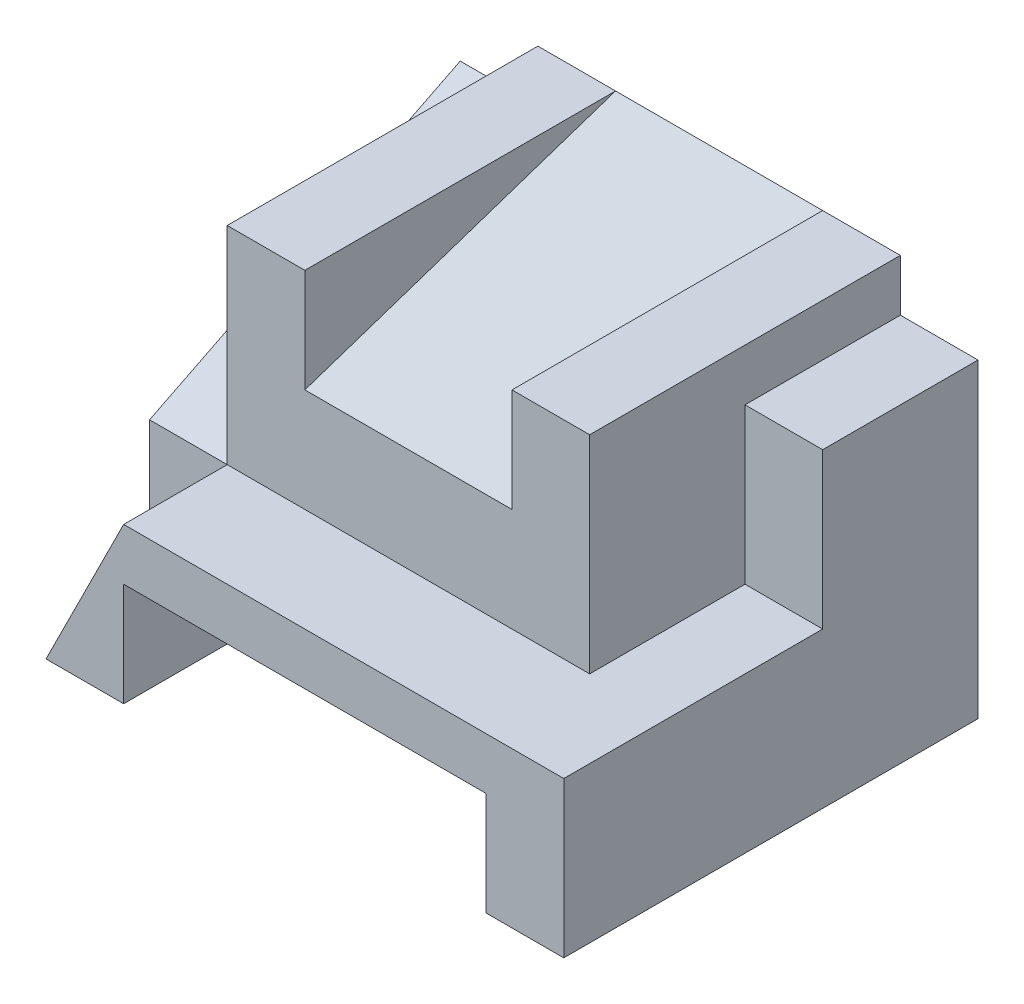
ISO-10303-21;
HEADER;
FILE_DESCRIPTION(('STEP AP214'),'2;1');
FILE_NAME('part.step','',(''),(''),'','','');
FILE_SCHEMA(('AUTOMOTIVE_DESIGN { 1 0 10303 214 1 1 1 1 }'));
ENDSEC;
DATA;
#1=APPLICATION_CONTEXT('core data for automotive mechanical design processes');
#2=APPLICATION_PROTOCOL_DEFINITION('international standard','automotive_design',2000,#1);
#3=PRODUCT_CONTEXT('',#1,'mechanical');
#4=PRODUCT('Part','Part','',(#3));
#5=PRODUCT_RELATED_PRODUCT_CATEGORY('part','',(#4));
#6=PRODUCT_DEFINITION_FORMATION('','',#4);
#7=PRODUCT_DEFINITION_CONTEXT('part definition',#1,'design');
#8=PRODUCT_DEFINITION('design','',#6,#7);
#9=PRODUCT_DEFINITION_SHAPE('','',#8);
#10=(LENGTH_UNIT() NAMED_UNIT(*) SI_UNIT(.MILLI.,.METRE.));
#11=(NAMED_UNIT(*) PLANE_ANGLE_UNIT() SI_UNIT($,.RADIAN.));
#12=(NAMED_UNIT(*) SI_UNIT($,.STERADIAN.) SOLID_ANGLE_UNIT());
#13=UNCERTAINTY_MEASURE_WITH_UNIT(LENGTH_MEASURE(1.E-05),#10,'distance_accuracy_value','');
#14=(GEOMETRIC_REPRESENTATION_CONTEXT(3) GLOBAL_UNCERTAINTY_ASSIGNED_CONTEXT((#13)) GLOBAL_UNIT_ASSIGNED_CONTEXT((#10,
#11,#12)) REPRESENTATION_CONTEXT('',''));
#15=CARTESIAN_POINT('',(0.,0.,0.));
#16=DIRECTION('',(0.,0.,1.));
#17=DIRECTION('',(1.,0.,0.));
#18=AXIS2_PLACEMENT_3D('',#15,#16,#17);
#19=CARTESIAN_POINT('',(-5.,3.,-8.));
#20=DIRECTION('',(0.,1.,0.));
#21=DIRECTION('',(0.,0.,1.));
#22=AXIS2_PLACEMENT_3D('',#19,#20,#21);
#23=PLANE('',#22);
#24=DIRECTION('',(0.,0.,1.));
#25=VECTOR('',#24,1.);
#26=CARTESIAN_POINT('',(5.,3.,-8.));
#27=LINE('',#26,#25);
#28=CARTESIAN_POINT('',(5.,3.,-5.));
#29=VERTEX_POINT('',#28);
#30=CARTESIAN_POINT('',(5.,3.,0.));
#31=VERTEX_POINT('',#30);
#32=EDGE_CURVE('E303',#29,#31,#27,.T.);
#33=ORIENTED_EDGE('',*,*,#32,.F.);
#34=DIRECTION('',(1.,0.,0.));
#35=VECTOR('',#34,1.);
#36=CARTESIAN_POINT('',(5.,3.,-5.));
#37=LINE('',#36,#35);
#38=CARTESIAN_POINT('',(3.5,3.,-5.));
#39=VERTEX_POINT('',#38);
#40=EDGE_CURVE('E178',#39,#29,#37,.T.);
#41=ORIENTED_EDGE('',*,*,#40,.F.);
#42=DIRECTION('',(0.,0.,1.));
#43=VECTOR('',#42,1.);
#44=CARTESIAN_POINT('',(3.5,3.,-8.));
#45=LINE('',#44,#43);
#46=CARTESIAN_POINT('',(3.5,3.,-2.));
#47=VERTEX_POINT('',#46);
#48=EDGE_CURVE('E183',#39,#47,#45,.T.);
#49=ORIENTED_EDGE('',*,*,#48,.T.);
#50=DIRECTION('',(1.,0.,0.));
#51=VECTOR('',#50,1.);
#52=CARTESIAN_POINT('',(3.5,3.,-2.));
#53=LINE('',#52,#51);
#54=CARTESIAN_POINT('',(-3.5,3.,-2.));
#55=VERTEX_POINT('',#54);
#56=EDGE_CURVE('E213',#55,#47,#53,.T.);
#57=ORIENTED_EDGE('',*,*,#56,.F.);
#58=DIRECTION('',(0.,0.,1.));
#59=VECTOR('',#58,1.);
#60=CARTESIAN_POINT('',(-3.5,3.,-2.));
#61=LINE('',#60,#59);
#62=CARTESIAN_POINT('',(-3.5,3.,0.));
#63=VERTEX_POINT('',#62);
#64=EDGE_CURVE('E254',#55,#63,#61,.T.);
#65=ORIENTED_EDGE('',*,*,#64,.T.);
#66=DIRECTION('',(-1.,0.,0.));
#67=VECTOR('',#66,1.);
#68=CARTESIAN_POINT('',(-5.,3.,0.));
#69=LINE('',#68,#67);
#70=EDGE_CURVE('E291',#31,#63,#69,.T.);
#71=ORIENTED_EDGE('',*,*,#70,.F.);
#72=EDGE_LOOP('',(#33,#41,#49,#57,#65,#71));
#73=FACE_BOUND('',#72,.T.);
#74=ADVANCED_FACE('F37',(#73),#23,.T.);
#75=CARTESIAN_POINT('',(3.5,7.,-8.));
#76=DIRECTION('',(1.,0.,0.));
#77=DIRECTION('',(0.,1.,0.));
#78=AXIS2_PLACEMENT_3D('',#75,#76,#77);
#79=PLANE('',#78);
#80=ORIENTED_EDGE('',*,*,#48,.F.);
#81=DIRECTION('',(0.,-1.,0.));
#82=VECTOR('',#81,1.);
#83=CARTESIAN_POINT('',(3.5,6.,-5.));
#84=LINE('',#83,#82);
#85=CARTESIAN_POINT('',(3.5,6.,-5.));
#86=VERTEX_POINT('',#85);
#87=EDGE_CURVE('E167',#86,#39,#84,.T.);
#88=ORIENTED_EDGE('',*,*,#87,.F.);
#89=DIRECTION('',(0.,0.,1.));
#90=VECTOR('',#89,1.);
#91=CARTESIAN_POINT('',(3.5,6.,-5.));
#92=LINE('',#91,#90);
#93=CARTESIAN_POINT('',(3.5,6.,-8.));
#94=VERTEX_POINT('',#93);
#95=EDGE_CURVE('E173',#94,#86,#92,.T.);
#96=ORIENTED_EDGE('',*,*,#95,.F.);
#97=DIRECTION('',(0.,1.,0.));
#98=VECTOR('',#97,1.);
#99=CARTESIAN_POINT('',(3.5,7.,-8.));
#100=LINE('',#99,#98);
#101=CARTESIAN_POINT('',(3.5,7.,-8.));
#102=VERTEX_POINT('',#101);
#103=EDGE_CURVE('E215',#94,#102,#100,.T.);
#104=ORIENTED_EDGE('',*,*,#103,.T.);
#105=DIRECTION('',(0.,0.,1.));
#106=VECTOR('',#105,1.);
#107=CARTESIAN_POINT('',(3.5,7.,-8.));
#108=LINE('',#107,#106);
#109=CARTESIAN_POINT('',(3.5,7.,-2.));
#110=VERTEX_POINT('',#109);
#111=EDGE_CURVE('E240',#102,#110,#108,.T.);
#112=ORIENTED_EDGE('',*,*,#111,.T.);
#113=DIRECTION('',(0.,1.,0.));
#114=VECTOR('',#113,1.);
#115=CARTESIAN_POINT('',(3.5,7.,-2.));
#116=LINE('',#115,#114);
#117=EDGE_CURVE('E227',#47,#110,#116,.T.);
#118=ORIENTED_EDGE('',*,*,#117,.F.);
#119=EDGE_LOOP('',(#80,#88,#96,#104,#112,#118));
#120=FACE_BOUND('',#119,.T.);
#121=ADVANCED_FACE('F181',(#120),#79,.T.);
#122=CARTESIAN_POINT('',(-3.5,3.,-8.));
#123=DIRECTION('',(-1.,0.,0.));
#124=DIRECTION('',(0.,-1.,0.));
#125=AXIS2_PLACEMENT_3D('',#122,#123,#124);
#126=PLANE('',#125);
#127=DIRECTION('',(0.,-1.,0.));
#128=VECTOR('',#127,1.);
#129=CARTESIAN_POINT('',(-3.5,3.,-8.));
#130=LINE('',#129,#128);
#131=CARTESIAN_POINT('',(-3.5,7.,-8.));
#132=VERTEX_POINT('',#131);
#133=CARTESIAN_POINT('',(-3.5,6.,-8.));
#134=VERTEX_POINT('',#133);
#135=EDGE_CURVE('E222',#132,#134,#130,.T.);
#136=ORIENTED_EDGE('',*,*,#135,.T.);
#137=DIRECTION('',(0.,0.447213595499958,-0.894427190999916));
#138=VECTOR('',#137,1.);
#139=CARTESIAN_POINT('',(-3.5,6.,-8.));
#140=LINE('',#139,#138);
#141=EDGE_CURVE('E184',#55,#134,#140,.T.);
#142=ORIENTED_EDGE('',*,*,#141,.F.);
#143=DIRECTION('',(0.,-1.,0.));
#144=VECTOR('',#143,1.);
#145=CARTESIAN_POINT('',(-3.5,3.,-2.));
#146=LINE('',#145,#144);
#147=CARTESIAN_POINT('',(-3.5,7.,-2.));
#148=VERTEX_POINT('',#147);
#149=EDGE_CURVE('E218',#148,#55,#146,.T.);
#150=ORIENTED_EDGE('',*,*,#149,.F.);
#151=DIRECTION('',(0.,0.,1.));
#152=VECTOR('',#151,1.);
#153=CARTESIAN_POINT('',(-3.5,7.,-8.));
#154=LINE('',#153,#152);
#155=EDGE_CURVE('E236',#132,#148,#154,.T.);
#156=ORIENTED_EDGE('',*,*,#155,.F.);
#157=EDGE_LOOP('',(#136,#142,#150,#156));
#158=FACE_BOUND('',#157,.T.);
#159=ADVANCED_FACE('F355',(#158),#126,.T.);
#160=CARTESIAN_POINT('',(-2.,5.,-2.));
#161=DIRECTION('',(-1.,0.,0.));
#162=DIRECTION('',(0.,0.,1.));
#163=AXIS2_PLACEMENT_3D('',#160,#161,#162);
#164=PLANE('',#163);
#165=DIRECTION('',(0.,0.316227766016838,-0.948683298050514));
#166=VECTOR('',#165,1.);
#167=CARTESIAN_POINT('',(-2.,7.,-8.));
#168=LINE('',#167,#166);
#169=CARTESIAN_POINT('',(-2.,5.,-2.));
#170=VERTEX_POINT('',#169);
#171=CARTESIAN_POINT('',(-2.,7.,-8.));
#172=VERTEX_POINT('',#171);
#173=EDGE_CURVE('E197',#170,#172,#168,.T.);
#174=ORIENTED_EDGE('',*,*,#173,.T.);
#175=DIRECTION('',(0.,0.,1.));
#176=VECTOR('',#175,1.);
#177=CARTESIAN_POINT('',(-2.,7.,-2.));
#178=LINE('',#177,#176);
#179=CARTESIAN_POINT('',(-2.,7.,-2.));
#180=VERTEX_POINT('',#179);
#181=EDGE_CURVE('E204',#172,#180,#178,.T.);
#182=ORIENTED_EDGE('',*,*,#181,.T.);
#183=DIRECTION('',(0.,1.,0.));
#184=VECTOR('',#183,1.);
#185=CARTESIAN_POINT('',(-2.,5.,-2.));
#186=LINE('',#185,#184);
#187=EDGE_CURVE('E62',#170,#180,#186,.T.);
#188=ORIENTED_EDGE('',*,*,#187,.F.);
#189=EDGE_LOOP('',(#174,#182,#188));
#190=FACE_BOUND('',#189,.T.);
#191=ADVANCED_FACE('F457',(#190),#164,.F.);
#192=CARTESIAN_POINT('',(2.,5.,-8.));
#193=DIRECTION('',(1.,0.,0.));
#194=DIRECTION('',(0.,0.,-1.));
#195=AXIS2_PLACEMENT_3D('',#192,#193,#194);
#196=PLANE('',#195);
#197=DIRECTION('',(0.,0.316227766016838,-0.948683298050514));
#198=VECTOR('',#197,1.);
#199=CARTESIAN_POINT('',(2.,7.,-8.));
#200=LINE('',#199,#198);
#201=CARTESIAN_POINT('',(2.,5.,-2.));
#202=VERTEX_POINT('',#201);
#203=CARTESIAN_POINT('',(2.,7.,-8.));
#204=VERTEX_POINT('',#203);
#205=EDGE_CURVE('E196',#202,#204,#200,.T.);
#206=ORIENTED_EDGE('',*,*,#205,.F.);
#207=DIRECTION('',(0.,1.,0.));
#208=VECTOR('',#207,1.);
#209=CARTESIAN_POINT('',(2.,5.,-2.));
#210=LINE('',#209,#208);
#211=CARTESIAN_POINT('',(2.,7.,-2.));
#212=VERTEX_POINT('',#211);
#213=EDGE_CURVE('E211',#202,#212,#210,.T.);
#214=ORIENTED_EDGE('',*,*,#213,.T.);
#215=DIRECTION('',(0.,0.,-1.));
#216=VECTOR('',#215,1.);
#217=CARTESIAN_POINT('',(2.,7.,-8.));
#218=LINE('',#217,#216);
#219=EDGE_CURVE('E208',#212,#204,#218,.T.);
#220=ORIENTED_EDGE('',*,*,#219,.T.);
#221=EDGE_LOOP('',(#206,#214,#220));
#222=FACE_BOUND('',#221,.T.);
#223=ADVANCED_FACE('F368',(#222),#196,.F.);
#224=CARTESIAN_POINT('',(-3.5,7.,-8.));
#225=DIRECTION('',(0.,1.,0.));
#226=DIRECTION('',(0.,0.,1.));
#227=AXIS2_PLACEMENT_3D('',#224,#225,#226);
#228=PLANE('',#227);
#229=ORIENTED_EDGE('',*,*,#181,.F.);
#230=DIRECTION('',(-1.,0.,0.));
#231=VECTOR('',#230,1.);
#232=CARTESIAN_POINT('',(-3.5,7.,-8.));
#233=LINE('',#232,#231);
#234=EDGE_CURVE('E217',#172,#132,#233,.T.);
#235=ORIENTED_EDGE('',*,*,#234,.T.);
#236=ORIENTED_EDGE('',*,*,#155,.T.);
#237=DIRECTION('',(-1.,0.,0.));
#238=VECTOR('',#237,1.);
#239=CARTESIAN_POINT('',(-3.5,7.,-2.));
#240=LINE('',#239,#238);
#241=EDGE_CURVE('E230',#180,#148,#240,.T.);
#242=ORIENTED_EDGE('',*,*,#241,.F.);
#243=EDGE_LOOP('',(#229,#235,#236,#242));
#244=FACE_BOUND('',#243,.T.);
#245=ADVANCED_FACE('F360',(#244),#228,.T.);
#246=CARTESIAN_POINT('',(-3.5,2.,-8.));
#247=DIRECTION('',(0.,-1.,0.));
#248=DIRECTION('',(0.,0.,-1.));
#249=AXIS2_PLACEMENT_3D('',#246,#247,#248);
#250=PLANE('',#249);
#251=DIRECTION('',(1.,0.,0.));
#252=VECTOR('',#251,1.);
#253=CARTESIAN_POINT('',(-3.5,2.,0.));
#254=LINE('',#253,#252);
#255=CARTESIAN_POINT('',(-3.5,2.,0.));
#256=VERTEX_POINT('',#255);
#257=CARTESIAN_POINT('',(3.5,2.,0.));
#258=VERTEX_POINT('',#257);
#259=EDGE_CURVE('E257',#256,#258,#254,.T.);
#260=ORIENTED_EDGE('',*,*,#259,.F.);
#261=DIRECTION('',(0.,0.,1.));
#262=VECTOR('',#261,1.);
#263=CARTESIAN_POINT('',(-3.5,2.,-8.));
#264=LINE('',#263,#262);
#265=CARTESIAN_POINT('',(-3.5,2.,-8.));
#266=VERTEX_POINT('',#265);
#267=EDGE_CURVE('E11',#266,#256,#264,.T.);
#268=ORIENTED_EDGE('',*,*,#267,.F.);
#269=DIRECTION('',(1.,0.,0.));
#270=VECTOR('',#269,1.);
#271=CARTESIAN_POINT('',(-3.5,2.,-8.));
#272=LINE('',#271,#270);
#273=CARTESIAN_POINT('',(3.5,2.,-8.));
#274=VERTEX_POINT('',#273);
#275=EDGE_CURVE('E259',#266,#274,#272,.T.);
#276=ORIENTED_EDGE('',*,*,#275,.T.);
#277=DIRECTION('',(0.,0.,1.));
#278=VECTOR('',#277,1.);
#279=CARTESIAN_POINT('',(3.5,2.,-8.));
#280=LINE('',#279,#278);
#281=EDGE_CURVE('E41',#274,#258,#280,.T.);
#282=ORIENTED_EDGE('',*,*,#281,.T.);
#283=EDGE_LOOP('',(#260,#268,#276,#282));
#284=FACE_BOUND('',#283,.T.);
#285=ADVANCED_FACE('F39',(#284),#250,.T.);
#286=CARTESIAN_POINT('',(-3.5,0.,-8.));
#287=DIRECTION('',(1.,0.,0.));
#288=DIRECTION('',(0.,1.,0.));
#289=AXIS2_PLACEMENT_3D('',#286,#287,#288);
#290=PLANE('',#289);
#291=DIRECTION('',(0.,1.,0.));
#292=VECTOR('',#291,1.);
#293=CARTESIAN_POINT('',(-3.5,0.,0.));
#294=LINE('',#293,#292);
#295=CARTESIAN_POINT('',(-3.5,0.,0.));
#296=VERTEX_POINT('',#295);
#297=EDGE_CURVE('E263',#296,#256,#294,.T.);
#298=ORIENTED_EDGE('',*,*,#297,.F.);
#299=DIRECTION('',(0.,0.,1.));
#300=VECTOR('',#299,1.);
#301=CARTESIAN_POINT('',(-3.5,0.,-8.));
#302=LINE('',#301,#300);
#303=CARTESIAN_POINT('',(-3.5,0.,-8.));
#304=VERTEX_POINT('',#303);
#305=EDGE_CURVE('E46',#304,#296,#302,.T.);
#306=ORIENTED_EDGE('',*,*,#305,.F.);
#307=DIRECTION('',(0.,1.,0.));
#308=VECTOR('',#307,1.);
#309=CARTESIAN_POINT('',(-3.5,0.,-8.));
#310=LINE('',#309,#308);
#311=EDGE_CURVE('E277',#304,#266,#310,.T.);
#312=ORIENTED_EDGE('',*,*,#311,.T.);
#313=ORIENTED_EDGE('',*,*,#267,.T.);
#314=EDGE_LOOP('',(#298,#306,#312,#313));
#315=FACE_BOUND('',#314,.T.);
#316=ADVANCED_FACE('F321',(#315),#290,.T.);
#317=CARTESIAN_POINT('',(-3.5,0.,-8.));
#318=DIRECTION('',(0.,-1.,0.));
#319=DIRECTION('',(1.,0.,0.));
#320=AXIS2_PLACEMENT_3D('',#317,#318,#319);
#321=PLANE('',#320);
#322=DIRECTION('',(1.,0.,0.));
#323=VECTOR('',#322,1.);
#324=CARTESIAN_POINT('',(-3.5,0.,0.));
#325=LINE('',#324,#323);
#326=CARTESIAN_POINT('',(-5.,0.,0.));
#327=VERTEX_POINT('',#326);
#328=EDGE_CURVE('E294',#327,#296,#325,.T.);
#329=ORIENTED_EDGE('',*,*,#328,.F.);
#330=DIRECTION('',(0.,0.,1.));
#331=VECTOR('',#330,1.);
#332=CARTESIAN_POINT('',(-5.,0.,-2.));
#333=LINE('',#332,#331);
#334=CARTESIAN_POINT('',(-5.,0.,-2.));
#335=VERTEX_POINT('',#334);
#336=EDGE_CURVE('E252',#335,#327,#333,.T.);
#337=ORIENTED_EDGE('',*,*,#336,.F.);
#338=DIRECTION('',(0.,0.,1.));
#339=VECTOR('',#338,1.);
#340=CARTESIAN_POINT('',(-5.,0.,-8.));
#341=LINE('',#340,#339);
#342=CARTESIAN_POINT('',(-5.,0.,-8.));
#343=VERTEX_POINT('',#342);
#344=EDGE_CURVE('E300',#343,#335,#341,.T.);
#345=ORIENTED_EDGE('',*,*,#344,.F.);
#346=DIRECTION('',(1.,0.,0.));
#347=VECTOR('',#346,1.);
#348=CARTESIAN_POINT('',(-3.5,0.,-8.));
#349=LINE('',#348,#347);
#350=EDGE_CURVE('E274',#343,#304,#349,.T.);
#351=ORIENTED_EDGE('',*,*,#350,.T.);
#352=ORIENTED_EDGE('',*,*,#305,.T.);
#353=EDGE_LOOP('',(#329,#337,#345,#351,#352));
#354=FACE_BOUND('',#353,.T.);
#355=ADVANCED_FACE('F346',(#354),#321,.T.);
#356=CARTESIAN_POINT('',(-5.,0.,-8.));
#357=DIRECTION('',(-1.,0.,0.));
#358=DIRECTION('',(0.,-1.,0.));
#359=AXIS2_PLACEMENT_3D('',#356,#357,#358);
#360=PLANE('',#359);
#361=DIRECTION('',(0.,-1.,0.));
#362=VECTOR('',#361,1.);
#363=CARTESIAN_POINT('',(-5.,3.,-2.));
#364=LINE('',#363,#362);
#365=CARTESIAN_POINT('',(-5.,3.,-2.));
#366=VERTEX_POINT('',#365);
#367=EDGE_CURVE('E243',#366,#335,#364,.T.);
#368=ORIENTED_EDGE('',*,*,#367,.F.);
#369=DIRECTION('',(0.,0.447213595499958,-0.894427190999916));
#370=VECTOR('',#369,1.);
#371=CARTESIAN_POINT('',(-5.,6.,-8.));
#372=LINE('',#371,#370);
#373=CARTESIAN_POINT('',(-5.,6.,-8.));
#374=VERTEX_POINT('',#373);
#375=EDGE_CURVE('E186',#366,#374,#372,.T.);
#376=ORIENTED_EDGE('',*,*,#375,.T.);
#377=DIRECTION('',(0.,-1.,0.));
#378=VECTOR('',#377,1.);
#379=CARTESIAN_POINT('',(-5.,0.,-8.));
#380=LINE('',#379,#378);
#381=EDGE_CURVE('E271',#374,#343,#380,.T.);
#382=ORIENTED_EDGE('',*,*,#381,.T.);
#383=ORIENTED_EDGE('',*,*,#344,.T.);
#384=EDGE_LOOP('',(#368,#376,#382,#383));
#385=FACE_BOUND('',#384,.T.);
#386=ADVANCED_FACE('F347',(#385),#360,.T.);
#387=CARTESIAN_POINT('',(5.,3.,-8.));
#388=DIRECTION('',(1.,0.,0.));
#389=DIRECTION('',(0.,1.,0.));
#390=AXIS2_PLACEMENT_3D('',#387,#388,#389);
#391=PLANE('',#390);
#392=DIRECTION('',(0.,1.,0.));
#393=VECTOR('',#392,1.);
#394=CARTESIAN_POINT('',(5.,3.,0.));
#395=LINE('',#394,#393);
#396=CARTESIAN_POINT('',(5.,0.,0.));
#397=VERTEX_POINT('',#396);
#398=EDGE_CURVE('E288',#397,#31,#395,.T.);
#399=ORIENTED_EDGE('',*,*,#398,.F.);
#400=DIRECTION('',(0.,0.,1.));
#401=VECTOR('',#400,1.);
#402=CARTESIAN_POINT('',(5.,0.,-8.));
#403=LINE('',#402,#401);
#404=CARTESIAN_POINT('',(5.,0.,-8.));
#405=VERTEX_POINT('',#404);
#406=EDGE_CURVE('E305',#405,#397,#403,.T.);
#407=ORIENTED_EDGE('',*,*,#406,.F.);
#408=DIRECTION('',(0.,1.,0.));
#409=VECTOR('',#408,1.);
#410=CARTESIAN_POINT('',(5.,3.,-8.));
#411=LINE('',#410,#409);
#412=CARTESIAN_POINT('',(5.,6.,-8.));
#413=VERTEX_POINT('',#412);
#414=EDGE_CURVE('E269',#405,#413,#411,.T.);
#415=ORIENTED_EDGE('',*,*,#414,.T.);
#416=DIRECTION('',(0.,0.,-1.));
#417=VECTOR('',#416,1.);
#418=CARTESIAN_POINT('',(5.,6.,-8.));
#419=LINE('',#418,#417);
#420=CARTESIAN_POINT('',(5.,6.,-5.));
#421=VERTEX_POINT('',#420);
#422=EDGE_CURVE('E172',#421,#413,#419,.T.);
#423=ORIENTED_EDGE('',*,*,#422,.F.);
#424=DIRECTION('',(0.,-1.,0.));
#425=VECTOR('',#424,1.);
#426=CARTESIAN_POINT('',(5.,6.,-5.));
#427=LINE('',#426,#425);
#428=EDGE_CURVE('E170',#421,#29,#427,.T.);
#429=ORIENTED_EDGE('',*,*,#428,.T.);
#430=ORIENTED_EDGE('',*,*,#32,.T.);
#431=EDGE_LOOP('',(#399,#407,#415,#423,#429,#430));
#432=FACE_BOUND('',#431,.T.);
#433=ADVANCED_FACE('F333',(#432),#391,.T.);
#434=CARTESIAN_POINT('',(5.,0.,-8.));
#435=DIRECTION('',(0.,-1.,0.));
#436=DIRECTION('',(1.,0.,0.));
#437=AXIS2_PLACEMENT_3D('',#434,#435,#436);
#438=PLANE('',#437);
#439=DIRECTION('',(1.,0.,0.));
#440=VECTOR('',#439,1.);
#441=CARTESIAN_POINT('',(5.,0.,0.));
#442=LINE('',#441,#440);
#443=CARTESIAN_POINT('',(3.5,0.,0.));
#444=VERTEX_POINT('',#443);
#445=EDGE_CURVE('E285',#444,#397,#442,.T.);
#446=ORIENTED_EDGE('',*,*,#445,.F.);
#447=DIRECTION('',(0.,0.,1.));
#448=VECTOR('',#447,1.);
#449=CARTESIAN_POINT('',(3.5,0.,-8.));
#450=LINE('',#449,#448);
#451=CARTESIAN_POINT('',(3.5,0.,-8.));
#452=VERTEX_POINT('',#451);
#453=EDGE_CURVE('E306',#452,#444,#450,.T.);
#454=ORIENTED_EDGE('',*,*,#453,.F.);
#455=DIRECTION('',(1.,0.,0.));
#456=VECTOR('',#455,1.);
#457=CARTESIAN_POINT('',(5.,0.,-8.));
#458=LINE('',#457,#456);
#459=EDGE_CURVE('E266',#452,#405,#458,.T.);
#460=ORIENTED_EDGE('',*,*,#459,.T.);
#461=ORIENTED_EDGE('',*,*,#406,.T.);
#462=EDGE_LOOP('',(#446,#454,#460,#461));
#463=FACE_BOUND('',#462,.T.);
#464=ADVANCED_FACE('F329',(#463),#438,.T.);
#465=CARTESIAN_POINT('',(3.5,2.,-8.));
#466=DIRECTION('',(-1.,0.,0.));
#467=DIRECTION('',(0.,-1.,0.));
#468=AXIS2_PLACEMENT_3D('',#465,#466,#467);
#469=PLANE('',#468);
#470=DIRECTION('',(0.,-1.,0.));
#471=VECTOR('',#470,1.);
#472=CARTESIAN_POINT('',(3.5,2.,0.));
#473=LINE('',#472,#471);
#474=EDGE_CURVE('E282',#258,#444,#473,.T.);
#475=ORIENTED_EDGE('',*,*,#474,.F.);
#476=ORIENTED_EDGE('',*,*,#281,.F.);
#477=DIRECTION('',(0.,-1.,0.));
#478=VECTOR('',#477,1.);
#479=CARTESIAN_POINT('',(3.5,2.,-8.));
#480=LINE('',#479,#478);
#481=EDGE_CURVE('E262',#274,#452,#480,.T.);
#482=ORIENTED_EDGE('',*,*,#481,.T.);
#483=ORIENTED_EDGE('',*,*,#453,.T.);
#484=EDGE_LOOP('',(#475,#476,#482,#483));
#485=FACE_BOUND('',#484,.T.);
#486=ADVANCED_FACE('F314',(#485),#469,.T.);
#487=CARTESIAN_POINT('',(0.,0.,-8.));
#488=DIRECTION('',(0.,0.,-1.));
#489=DIRECTION('',(-1.,0.,0.));
#490=AXIS2_PLACEMENT_3D('',#487,#488,#489);
#491=PLANE('',#490);
#492=ORIENTED_EDGE('',*,*,#381,.F.);
#493=DIRECTION('',(1.,0.,0.));
#494=VECTOR('',#493,1.);
#495=CARTESIAN_POINT('',(-5.,6.,-8.));
#496=LINE('',#495,#494);
#497=EDGE_CURVE('E192',#374,#134,#496,.T.);
#498=ORIENTED_EDGE('',*,*,#497,.T.);
#499=ORIENTED_EDGE('',*,*,#135,.F.);
#500=ORIENTED_EDGE('',*,*,#234,.F.);
#501=DIRECTION('',(1.,0.,0.));
#502=VECTOR('',#501,1.);
#503=CARTESIAN_POINT('',(-2.,7.,-8.));
#504=LINE('',#503,#502);
#505=EDGE_CURVE('E199',#172,#204,#504,.T.);
#506=ORIENTED_EDGE('',*,*,#505,.T.);
#507=EDGE_CURVE('E219',#102,#204,#233,.T.);
#508=ORIENTED_EDGE('',*,*,#507,.F.);
#509=ORIENTED_EDGE('',*,*,#103,.F.);
#510=DIRECTION('',(-1.,0.,0.));
#511=VECTOR('',#510,1.);
#512=CARTESIAN_POINT('',(3.5,6.,-8.));
#513=LINE('',#512,#511);
#514=EDGE_CURVE('E54',#413,#94,#513,.T.);
#515=ORIENTED_EDGE('',*,*,#514,.F.);
#516=ORIENTED_EDGE('',*,*,#414,.F.);
#517=ORIENTED_EDGE('',*,*,#459,.F.);
#518=ORIENTED_EDGE('',*,*,#481,.F.);
#519=ORIENTED_EDGE('',*,*,#275,.F.);
#520=ORIENTED_EDGE('',*,*,#311,.F.);
#521=ORIENTED_EDGE('',*,*,#350,.F.);
#522=EDGE_LOOP('',(#492,#498,#499,#500,#506,#508,#509,#515,#516,#517,#518,#519,#520,#521));
#523=FACE_BOUND('',#522,.T.);
#524=ADVANCED_FACE('F324',(#523),#491,.T.);
#525=CARTESIAN_POINT('',(0.,0.,0.));
#526=DIRECTION('',(0.,0.,-1.));
#527=DIRECTION('',(-1.,0.,0.));
#528=AXIS2_PLACEMENT_3D('',#525,#526,#527);
#529=PLANE('',#528);
#530=ORIENTED_EDGE('',*,*,#70,.T.);
#531=DIRECTION('',(0.447213595499958,0.894427190999916,0.));
#532=VECTOR('',#531,1.);
#533=CARTESIAN_POINT('',(-5.,0.,0.));
#534=LINE('',#533,#532);
#535=EDGE_CURVE('E239',#327,#63,#534,.T.);
#536=ORIENTED_EDGE('',*,*,#535,.F.);
#537=ORIENTED_EDGE('',*,*,#328,.T.);
#538=ORIENTED_EDGE('',*,*,#297,.T.);
#539=ORIENTED_EDGE('',*,*,#259,.T.);
#540=ORIENTED_EDGE('',*,*,#474,.T.);
#541=ORIENTED_EDGE('',*,*,#445,.T.);
#542=ORIENTED_EDGE('',*,*,#398,.T.);
#543=EDGE_LOOP('',(#530,#536,#537,#538,#539,#540,#541,#542));
#544=FACE_BOUND('',#543,.T.);
#545=ADVANCED_FACE('F316',(#544),#529,.F.);
#546=CARTESIAN_POINT('',(-5.,0.,-2.));
#547=DIRECTION('',(0.894427190999916,-0.447213595499958,0.));
#548=DIRECTION('',(0.447213595499958,0.894427190999916,0.));
#549=AXIS2_PLACEMENT_3D('',#546,#547,#548);
#550=PLANE('',#549);
#551=ORIENTED_EDGE('',*,*,#535,.T.);
#552=ORIENTED_EDGE('',*,*,#64,.F.);
#553=DIRECTION('',(0.447213595499958,0.894427190999916,0.));
#554=VECTOR('',#553,1.);
#555=CARTESIAN_POINT('',(-5.,0.,-2.));
#556=LINE('',#555,#554);
#557=EDGE_CURVE('E246',#335,#55,#556,.T.);
#558=ORIENTED_EDGE('',*,*,#557,.F.);
#559=ORIENTED_EDGE('',*,*,#336,.T.);
#560=EDGE_LOOP('',(#551,#552,#558,#559));
#561=FACE_BOUND('',#560,.T.);
#562=ADVANCED_FACE('F339',(#561),#550,.F.);
#563=CARTESIAN_POINT('',(0.,0.,-2.));
#564=DIRECTION('',(0.,0.,-1.));
#565=DIRECTION('',(-1.,0.,0.));
#566=AXIS2_PLACEMENT_3D('',#563,#564,#565);
#567=PLANE('',#566);
#568=ORIENTED_EDGE('',*,*,#367,.T.);
#569=ORIENTED_EDGE('',*,*,#557,.T.);
#570=DIRECTION('',(-1.,0.,0.));
#571=VECTOR('',#570,1.);
#572=CARTESIAN_POINT('',(-3.5,3.,-2.));
#573=LINE('',#572,#571);
#574=EDGE_CURVE('E249',#55,#366,#573,.T.);
#575=ORIENTED_EDGE('',*,*,#574,.T.);
#576=EDGE_LOOP('',(#568,#569,#575));
#577=FACE_BOUND('',#576,.T.);
#578=ADVANCED_FACE('F341',(#577),#567,.F.);
#579=ORIENTED_EDGE('',*,*,#219,.F.);
#580=EDGE_CURVE('E231',#110,#212,#240,.T.);
#581=ORIENTED_EDGE('',*,*,#580,.F.);
#582=ORIENTED_EDGE('',*,*,#111,.F.);
#583=ORIENTED_EDGE('',*,*,#507,.T.);
#584=EDGE_LOOP('',(#579,#581,#582,#583));
#585=FACE_BOUND('',#584,.T.);
#586=ADVANCED_FACE('F373',(#585),#228,.T.);
#587=CARTESIAN_POINT('',(0.,0.,-2.));
#588=DIRECTION('',(0.,0.,-1.));
#589=DIRECTION('',(-1.,0.,0.));
#590=AXIS2_PLACEMENT_3D('',#587,#588,#589);
#591=PLANE('',#590);
#592=DIRECTION('',(1.,0.,0.));
#593=VECTOR('',#592,1.);
#594=CARTESIAN_POINT('',(2.,5.,-2.));
#595=LINE('',#594,#593);
#596=EDGE_CURVE('E205',#170,#202,#595,.T.);
#597=ORIENTED_EDGE('',*,*,#596,.F.);
#598=ORIENTED_EDGE('',*,*,#187,.T.);
#599=ORIENTED_EDGE('',*,*,#241,.T.);
#600=ORIENTED_EDGE('',*,*,#149,.T.);
#601=ORIENTED_EDGE('',*,*,#56,.T.);
#602=ORIENTED_EDGE('',*,*,#117,.T.);
#603=ORIENTED_EDGE('',*,*,#580,.T.);
#604=ORIENTED_EDGE('',*,*,#213,.F.);
#605=EDGE_LOOP('',(#597,#598,#599,#600,#601,#602,#603,#604));
#606=FACE_BOUND('',#605,.T.);
#607=ADVANCED_FACE('F375',(#606),#591,.F.);
#608=CARTESIAN_POINT('',(-2.,7.,-8.));
#609=DIRECTION('',(0.,-0.948683298050514,-0.316227766016838));
#610=DIRECTION('',(0.,0.316227766016838,-0.948683298050514));
#611=AXIS2_PLACEMENT_3D('',#608,#609,#610);
#612=PLANE('',#611);
#613=ORIENTED_EDGE('',*,*,#205,.T.);
#614=ORIENTED_EDGE('',*,*,#505,.F.);
#615=ORIENTED_EDGE('',*,*,#173,.F.);
#616=ORIENTED_EDGE('',*,*,#596,.T.);
#617=EDGE_LOOP('',(#613,#614,#615,#616));
#618=FACE_BOUND('',#617,.T.);
#619=ADVANCED_FACE('F365',(#618),#612,.F.);
#620=CARTESIAN_POINT('',(-5.,6.,-8.));
#621=DIRECTION('',(0.,-0.894427190999916,-0.447213595499958));
#622=DIRECTION('',(0.,0.447213595499958,-0.894427190999916));
#623=AXIS2_PLACEMENT_3D('',#620,#621,#622);
#624=PLANE('',#623);
#625=ORIENTED_EDGE('',*,*,#141,.T.);
#626=ORIENTED_EDGE('',*,*,#497,.F.);
#627=ORIENTED_EDGE('',*,*,#375,.F.);
#628=ORIENTED_EDGE('',*,*,#574,.F.);
#629=EDGE_LOOP('',(#625,#626,#627,#628));
#630=FACE_BOUND('',#629,.T.);
#631=ADVANCED_FACE('F382',(#630),#624,.F.);
#632=CARTESIAN_POINT('',(5.,6.,-5.));
#633=DIRECTION('',(0.,0.,-1.));
#634=DIRECTION('',(-1.,0.,0.));
#635=AXIS2_PLACEMENT_3D('',#632,#633,#634);
#636=PLANE('',#635);
#637=ORIENTED_EDGE('',*,*,#40,.T.);
#638=ORIENTED_EDGE('',*,*,#428,.F.);
#639=DIRECTION('',(1.,0.,0.));
#640=VECTOR('',#639,1.);
#641=CARTESIAN_POINT('',(5.,6.,-5.));
#642=LINE('',#641,#640);
#643=EDGE_CURVE('E164',#86,#421,#642,.T.);
#644=ORIENTED_EDGE('',*,*,#643,.F.);
#645=ORIENTED_EDGE('',*,*,#87,.T.);
#646=EDGE_LOOP('',(#637,#638,#644,#645));
#647=FACE_BOUND('',#646,.T.);
#648=ADVANCED_FACE('F165',(#647),#636,.F.);
#649=CARTESIAN_POINT('',(0.,6.,0.));
#650=DIRECTION('',(0.,-1.,0.));
#651=DIRECTION('',(0.,0.,-1.));
#652=AXIS2_PLACEMENT_3D('',#649,#650,#651);
#653=PLANE('',#652);
#654=ORIENTED_EDGE('',*,*,#95,.T.);
#655=ORIENTED_EDGE('',*,*,#643,.T.);
#656=ORIENTED_EDGE('',*,*,#422,.T.);
#657=ORIENTED_EDGE('',*,*,#514,.T.);
#658=EDGE_LOOP('',(#654,#655,#656,#657));
#659=FACE_BOUND('',#658,.T.);
#660=ADVANCED_FACE('F175',(#659),#653,.F.);
#661=CLOSED_SHELL('',(#74,#121,#159,#191,#223,#245,#285,#316,#355,#386,#433,#464,#486,#524,#545,
#562,#578,#586,#607,#619,#631,#648,#660));
#662=MANIFOLD_SOLID_BREP('B2',#661);
#663=ADVANCED_BREP_SHAPE_REPRESENTATION('',(#18,#662),#14);
#664=SHAPE_DEFINITION_REPRESENTATION(#9,#663);
ENDSEC;
END-ISO-10303-21;
